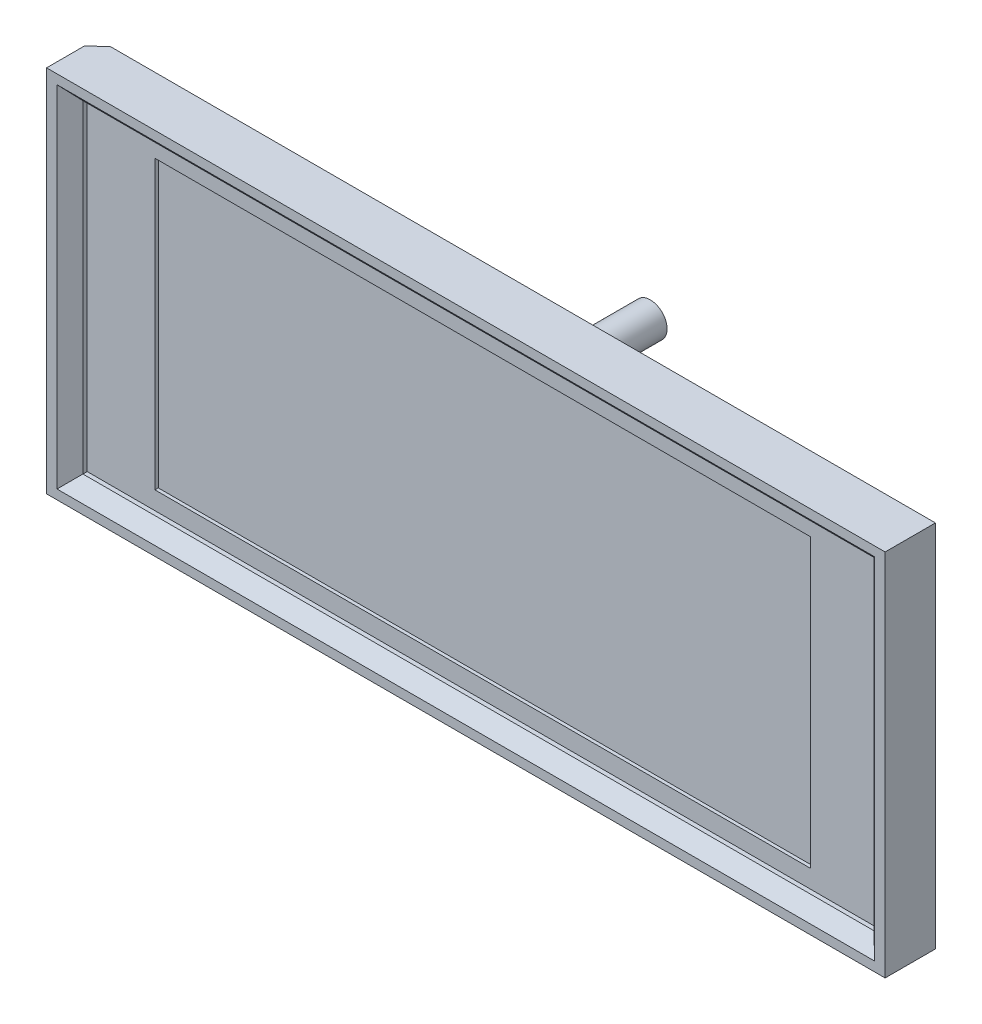
ISO-10303-21;
HEADER;
FILE_DESCRIPTION(('STEP AP214'),'2;1');
FILE_NAME('part.step','',(''),(''),'','','');
FILE_SCHEMA(('AUTOMOTIVE_DESIGN { 1 0 10303 214 1 1 1 1 }'));
ENDSEC;
DATA;
#1=APPLICATION_CONTEXT('core data for automotive mechanical design processes');
#2=APPLICATION_PROTOCOL_DEFINITION('international standard','automotive_design',2000,#1);
#3=PRODUCT_CONTEXT('',#1,'mechanical');
#4=PRODUCT('Part','Part','',(#3));
#5=PRODUCT_RELATED_PRODUCT_CATEGORY('part','',(#4));
#6=PRODUCT_DEFINITION_FORMATION('','',#4);
#7=PRODUCT_DEFINITION_CONTEXT('part definition',#1,'design');
#8=PRODUCT_DEFINITION('design','',#6,#7);
#9=PRODUCT_DEFINITION_SHAPE('','',#8);
#10=(LENGTH_UNIT() NAMED_UNIT(*) SI_UNIT(.MILLI.,.METRE.));
#11=(NAMED_UNIT(*) PLANE_ANGLE_UNIT() SI_UNIT($,.RADIAN.));
#12=(NAMED_UNIT(*) SI_UNIT($,.STERADIAN.) SOLID_ANGLE_UNIT());
#13=UNCERTAINTY_MEASURE_WITH_UNIT(LENGTH_MEASURE(1.E-05),#10,'distance_accuracy_value','');
#14=(GEOMETRIC_REPRESENTATION_CONTEXT(3) GLOBAL_UNCERTAINTY_ASSIGNED_CONTEXT((#13)) GLOBAL_UNIT_ASSIGNED_CONTEXT((#10,
#11,#12)) REPRESENTATION_CONTEXT('',''));
#15=CARTESIAN_POINT('',(0.,0.,0.));
#16=DIRECTION('',(0.,0.,1.));
#17=DIRECTION('',(1.,0.,0.));
#18=AXIS2_PLACEMENT_3D('',#15,#16,#17);
#19=CARTESIAN_POINT('',(0.,0.,10.));
#20=DIRECTION('',(0.,0.,-1.));
#21=DIRECTION('',(-1.,0.,0.));
#22=AXIS2_PLACEMENT_3D('',#19,#20,#21);
#23=PLANE('',#22);
#24=DIRECTION('',(0.,1.,0.));
#25=VECTOR('',#24,1.);
#26=CARTESIAN_POINT('',(117.897170083495,-48.1943324583654,10.));
#27=LINE('',#26,#25);
#28=CARTESIAN_POINT('',(117.897170083495,-48.1943324583654,10.));
#29=VERTEX_POINT('',#28);
#30=CARTESIAN_POINT('',(117.897170083495,48.1943324583654,10.));
#31=VERTEX_POINT('',#30);
#32=EDGE_CURVE('E182',#29,#31,#27,.T.);
#33=ORIENTED_EDGE('',*,*,#32,.T.);
#34=DIRECTION('',(-1.,0.,0.));
#35=VECTOR('',#34,1.);
#36=CARTESIAN_POINT('',(-117.897170083495,48.1943324583654,10.));
#37=LINE('',#36,#35);
#38=CARTESIAN_POINT('',(-117.897170083495,48.1943324583654,10.));
#39=VERTEX_POINT('',#38);
#40=EDGE_CURVE('E189',#31,#39,#37,.T.);
#41=ORIENTED_EDGE('',*,*,#40,.T.);
#42=DIRECTION('',(0.,-1.,0.));
#43=VECTOR('',#42,1.);
#44=CARTESIAN_POINT('',(-117.897170083495,-48.1943324583654,10.));
#45=LINE('',#44,#43);
#46=CARTESIAN_POINT('',(-117.897170083495,-48.1943324583654,10.));
#47=VERTEX_POINT('',#46);
#48=EDGE_CURVE('E192',#39,#47,#45,.T.);
#49=ORIENTED_EDGE('',*,*,#48,.T.);
#50=DIRECTION('',(1.,0.,0.));
#51=VECTOR('',#50,1.);
#52=CARTESIAN_POINT('',(-117.897170083495,-48.1943324583654,10.));
#53=LINE('',#52,#51);
#54=EDGE_CURVE('E195',#47,#29,#53,.T.);
#55=ORIENTED_EDGE('',*,*,#54,.T.);
#56=EDGE_LOOP('',(#33,#41,#49,#55));
#57=FACE_BOUND('',#56,.T.);
#58=DIRECTION('',(0.,1.,0.));
#59=VECTOR('',#58,1.);
#60=CARTESIAN_POINT('',(97.6929291235251,-42.8106903286789,10.));
#61=LINE('',#60,#59);
#62=CARTESIAN_POINT('',(97.6929291235251,-42.8106903286789,10.));
#63=VERTEX_POINT('',#62);
#64=CARTESIAN_POINT('',(97.6929291235251,42.8106903286789,10.));
#65=VERTEX_POINT('',#64);
#66=EDGE_CURVE('E148',#63,#65,#61,.T.);
#67=ORIENTED_EDGE('',*,*,#66,.F.);
#68=DIRECTION('',(1.,0.,0.));
#69=VECTOR('',#68,1.);
#70=CARTESIAN_POINT('',(-97.6929291235251,-42.8106903286789,10.));
#71=LINE('',#70,#69);
#72=CARTESIAN_POINT('',(-97.6929291235251,-42.8106903286789,10.));
#73=VERTEX_POINT('',#72);
#74=EDGE_CURVE('E165',#73,#63,#71,.T.);
#75=ORIENTED_EDGE('',*,*,#74,.F.);
#76=DIRECTION('',(0.,-1.,0.));
#77=VECTOR('',#76,1.);
#78=CARTESIAN_POINT('',(-97.6929291235251,-42.8106903286789,10.));
#79=LINE('',#78,#77);
#80=CARTESIAN_POINT('',(-97.6929291235251,42.8106903286789,10.));
#81=VERTEX_POINT('',#80);
#82=EDGE_CURVE('E168',#81,#73,#79,.T.);
#83=ORIENTED_EDGE('',*,*,#82,.F.);
#84=DIRECTION('',(-1.,0.,0.));
#85=VECTOR('',#84,1.);
#86=CARTESIAN_POINT('',(-97.6929291235251,42.8106903286789,10.));
#87=LINE('',#86,#85);
#88=EDGE_CURVE('E177',#65,#81,#87,.T.);
#89=ORIENTED_EDGE('',*,*,#88,.F.);
#90=EDGE_LOOP('',(#67,#75,#83,#89));
#91=FACE_BOUND('',#90,.T.);
#92=ADVANCED_FACE('F33',(#57,#91),#23,.F.);
#93=CARTESIAN_POINT('',(125.,-55.,15.));
#94=DIRECTION('',(-1.,0.,0.));
#95=DIRECTION('',(0.,0.,1.));
#96=AXIS2_PLACEMENT_3D('',#93,#94,#95);
#97=PLANE('',#96);
#98=DIRECTION('',(0.,1.,0.));
#99=VECTOR('',#98,1.);
#100=CARTESIAN_POINT('',(125.,-55.,0.));
#101=LINE('',#100,#99);
#102=CARTESIAN_POINT('',(125.,-55.,0.));
#103=VERTEX_POINT('',#102);
#104=CARTESIAN_POINT('',(125.,55.,0.));
#105=VERTEX_POINT('',#104);
#106=EDGE_CURVE('E201',#103,#105,#101,.T.);
#107=ORIENTED_EDGE('',*,*,#106,.T.);
#108=DIRECTION('',(0.,0.,-1.));
#109=VECTOR('',#108,1.);
#110=CARTESIAN_POINT('',(125.,55.,15.));
#111=LINE('',#110,#109);
#112=CARTESIAN_POINT('',(125.,55.,15.));
#113=VERTEX_POINT('',#112);
#114=EDGE_CURVE('E233',#113,#105,#111,.T.);
#115=ORIENTED_EDGE('',*,*,#114,.F.);
#116=DIRECTION('',(0.,1.,0.));
#117=VECTOR('',#116,1.);
#118=CARTESIAN_POINT('',(125.,-55.,15.));
#119=LINE('',#118,#117);
#120=CARTESIAN_POINT('',(125.,-55.,15.));
#121=VERTEX_POINT('',#120);
#122=EDGE_CURVE('E208',#121,#113,#119,.T.);
#123=ORIENTED_EDGE('',*,*,#122,.F.);
#124=DIRECTION('',(0.,0.,-1.));
#125=VECTOR('',#124,1.);
#126=CARTESIAN_POINT('',(125.,-55.,15.));
#127=LINE('',#126,#125);
#128=EDGE_CURVE('E218',#121,#103,#127,.T.);
#129=ORIENTED_EDGE('',*,*,#128,.T.);
#130=EDGE_LOOP('',(#107,#115,#123,#129));
#131=FACE_BOUND('',#130,.T.);
#132=ADVANCED_FACE('F309',(#131),#97,.F.);
#133=CARTESIAN_POINT('',(-125.,55.,15.));
#134=DIRECTION('',(0.,-1.,0.));
#135=DIRECTION('',(0.,0.,-1.));
#136=AXIS2_PLACEMENT_3D('',#133,#134,#135);
#137=PLANE('',#136);
#138=DIRECTION('',(-1.,0.,0.));
#139=VECTOR('',#138,1.);
#140=CARTESIAN_POINT('',(-125.,55.,0.));
#141=LINE('',#140,#139);
#142=CARTESIAN_POINT('',(-121.,55.,0.));
#143=VERTEX_POINT('',#142);
#144=EDGE_CURVE('E221',#105,#143,#141,.T.);
#145=ORIENTED_EDGE('',*,*,#144,.T.);
#146=DIRECTION('',(-0.731353701619173,0.,0.681998360062496));
#147=VECTOR('',#146,1.);
#148=CARTESIAN_POINT('',(-125.,55.,3.73006034455065));
#149=LINE('',#148,#147);
#150=CARTESIAN_POINT('',(-125.,55.,3.73006034455065));
#151=VERTEX_POINT('',#150);
#152=EDGE_CURVE('E243',#143,#151,#149,.T.);
#153=ORIENTED_EDGE('',*,*,#152,.T.);
#154=DIRECTION('',(0.,0.,-1.));
#155=VECTOR('',#154,1.);
#156=CARTESIAN_POINT('',(-125.,55.,15.));
#157=LINE('',#156,#155);
#158=CARTESIAN_POINT('',(-125.,55.,15.));
#159=VERTEX_POINT('',#158);
#160=EDGE_CURVE('E230',#159,#151,#157,.T.);
#161=ORIENTED_EDGE('',*,*,#160,.F.);
#162=DIRECTION('',(-1.,0.,0.));
#163=VECTOR('',#162,1.);
#164=CARTESIAN_POINT('',(-125.,55.,15.));
#165=LINE('',#164,#163);
#166=EDGE_CURVE('E211',#113,#159,#165,.T.);
#167=ORIENTED_EDGE('',*,*,#166,.F.);
#168=ORIENTED_EDGE('',*,*,#114,.T.);
#169=EDGE_LOOP('',(#145,#153,#161,#167,#168));
#170=FACE_BOUND('',#169,.T.);
#171=ADVANCED_FACE('F314',(#170),#137,.F.);
#172=CARTESIAN_POINT('',(-125.,-55.,15.));
#173=DIRECTION('',(1.,0.,0.));
#174=DIRECTION('',(0.,0.,-1.));
#175=AXIS2_PLACEMENT_3D('',#172,#173,#174);
#176=PLANE('',#175);
#177=ORIENTED_EDGE('',*,*,#160,.T.);
#178=DIRECTION('',(0.,-1.,0.));
#179=VECTOR('',#178,1.);
#180=CARTESIAN_POINT('',(-125.,-55.,3.73006034455065));
#181=LINE('',#180,#179);
#182=CARTESIAN_POINT('',(-125.,-55.,3.73006034455065));
#183=VERTEX_POINT('',#182);
#184=EDGE_CURVE('E236',#151,#183,#181,.T.);
#185=ORIENTED_EDGE('',*,*,#184,.T.);
#186=DIRECTION('',(0.,0.,-1.));
#187=VECTOR('',#186,1.);
#188=CARTESIAN_POINT('',(-125.,-55.,15.));
#189=LINE('',#188,#187);
#190=CARTESIAN_POINT('',(-125.,-55.,15.));
#191=VERTEX_POINT('',#190);
#192=EDGE_CURVE('E227',#191,#183,#189,.T.);
#193=ORIENTED_EDGE('',*,*,#192,.F.);
#194=DIRECTION('',(0.,-1.,0.));
#195=VECTOR('',#194,1.);
#196=CARTESIAN_POINT('',(-125.,-55.,15.));
#197=LINE('',#196,#195);
#198=EDGE_CURVE('E214',#159,#191,#197,.T.);
#199=ORIENTED_EDGE('',*,*,#198,.F.);
#200=EDGE_LOOP('',(#177,#185,#193,#199));
#201=FACE_BOUND('',#200,.T.);
#202=ADVANCED_FACE('F335',(#201),#176,.F.);
#203=CARTESIAN_POINT('',(-125.,-55.,15.));
#204=DIRECTION('',(0.,1.,0.));
#205=DIRECTION('',(0.,0.,1.));
#206=AXIS2_PLACEMENT_3D('',#203,#204,#205);
#207=PLANE('',#206);
#208=ORIENTED_EDGE('',*,*,#192,.T.);
#209=DIRECTION('',(0.731353701619173,0.,-0.681998360062496));
#210=VECTOR('',#209,1.);
#211=CARTESIAN_POINT('',(-125.,-55.,3.73006034455065));
#212=LINE('',#211,#210);
#213=CARTESIAN_POINT('',(-121.,-55.,0.));
#214=VERTEX_POINT('',#213);
#215=EDGE_CURVE('E239',#183,#214,#212,.T.);
#216=ORIENTED_EDGE('',*,*,#215,.T.);
#217=DIRECTION('',(1.,0.,0.));
#218=VECTOR('',#217,1.);
#219=CARTESIAN_POINT('',(-125.,-55.,0.));
#220=LINE('',#219,#218);
#221=EDGE_CURVE('E212',#214,#103,#220,.T.);
#222=ORIENTED_EDGE('',*,*,#221,.T.);
#223=ORIENTED_EDGE('',*,*,#128,.F.);
#224=DIRECTION('',(1.,0.,0.));
#225=VECTOR('',#224,1.);
#226=CARTESIAN_POINT('',(-125.,-55.,15.));
#227=LINE('',#226,#225);
#228=EDGE_CURVE('E216',#191,#121,#227,.T.);
#229=ORIENTED_EDGE('',*,*,#228,.F.);
#230=EDGE_LOOP('',(#208,#216,#222,#223,#229));
#231=FACE_BOUND('',#230,.T.);
#232=ADVANCED_FACE('F331',(#231),#207,.F.);
#233=CARTESIAN_POINT('',(0.,0.,15.));
#234=DIRECTION('',(0.,0.,-1.));
#235=DIRECTION('',(-1.,0.,0.));
#236=AXIS2_PLACEMENT_3D('',#233,#234,#235);
#237=PLANE('',#236);
#238=DIRECTION('',(0.,-1.,0.));
#239=VECTOR('',#238,1.);
#240=CARTESIAN_POINT('',(121.897170083495,0.,15.));
#241=LINE('',#240,#239);
#242=CARTESIAN_POINT('',(121.897170083495,52.1943324583654,15.));
#243=VERTEX_POINT('',#242);
#244=CARTESIAN_POINT('',(121.897170083495,-52.1943324583654,15.));
#245=VERTEX_POINT('',#244);
#246=EDGE_CURVE('E252',#243,#245,#241,.T.);
#247=ORIENTED_EDGE('',*,*,#246,.T.);
#248=DIRECTION('',(-1.,0.,0.));
#249=VECTOR('',#248,1.);
#250=CARTESIAN_POINT('',(0.,-52.1943324583654,15.));
#251=LINE('',#250,#249);
#252=CARTESIAN_POINT('',(-121.897170083495,-52.1943324583654,15.));
#253=VERTEX_POINT('',#252);
#254=EDGE_CURVE('E254',#245,#253,#251,.T.);
#255=ORIENTED_EDGE('',*,*,#254,.T.);
#256=DIRECTION('',(0.,1.,0.));
#257=VECTOR('',#256,1.);
#258=CARTESIAN_POINT('',(-121.897170083495,0.,15.));
#259=LINE('',#258,#257);
#260=CARTESIAN_POINT('',(-121.897170083495,52.1943324583654,15.));
#261=VERTEX_POINT('',#260);
#262=EDGE_CURVE('E248',#253,#261,#259,.T.);
#263=ORIENTED_EDGE('',*,*,#262,.T.);
#264=DIRECTION('',(1.,0.,0.));
#265=VECTOR('',#264,1.);
#266=CARTESIAN_POINT('',(0.,52.1943324583654,15.));
#267=LINE('',#266,#265);
#268=EDGE_CURVE('E250',#261,#243,#267,.T.);
#269=ORIENTED_EDGE('',*,*,#268,.T.);
#270=EDGE_LOOP('',(#247,#255,#263,#269));
#271=FACE_BOUND('',#270,.T.);
#272=ORIENTED_EDGE('',*,*,#122,.T.);
#273=ORIENTED_EDGE('',*,*,#166,.T.);
#274=ORIENTED_EDGE('',*,*,#198,.T.);
#275=ORIENTED_EDGE('',*,*,#228,.T.);
#276=EDGE_LOOP('',(#272,#273,#274,#275));
#277=FACE_BOUND('',#276,.T.);
#278=ADVANCED_FACE('F278',(#271,#277),#237,.F.);
#279=CARTESIAN_POINT('',(0.,0.,0.));
#280=DIRECTION('',(0.,0.,-1.));
#281=DIRECTION('',(-1.,0.,0.));
#282=AXIS2_PLACEMENT_3D('',#279,#280,#281);
#283=PLANE('',#282);
#284=CARTESIAN_POINT('',(0.,25.093271362693,0.));
#285=DIRECTION('',(0.,0.,-1.));
#286=DIRECTION('',(-1.,0.,0.));
#287=AXIS2_PLACEMENT_3D('',#284,#285,#286);
#288=CIRCLE('',#287,5.);
#289=CARTESIAN_POINT('',(-5.,25.093271362693,0.));
#290=VERTEX_POINT('',#289);
#291=EDGE_CURVE('E171',#290,#290,#288,.T.);
#292=ORIENTED_EDGE('',*,*,#291,.F.);
#293=EDGE_LOOP('',(#292));
#294=FACE_BOUND('',#293,.T.);
#295=ORIENTED_EDGE('',*,*,#221,.F.);
#296=DIRECTION('',(0.,1.,0.));
#297=VECTOR('',#296,1.);
#298=CARTESIAN_POINT('',(-121.,55.,0.));
#299=LINE('',#298,#297);
#300=EDGE_CURVE('E241',#214,#143,#299,.T.);
#301=ORIENTED_EDGE('',*,*,#300,.T.);
#302=ORIENTED_EDGE('',*,*,#144,.F.);
#303=ORIENTED_EDGE('',*,*,#106,.F.);
#304=EDGE_LOOP('',(#295,#301,#302,#303));
#305=FACE_BOUND('',#304,.T.);
#306=ADVANCED_FACE('F323',(#294,#305),#283,.T.);
#307=CARTESIAN_POINT('',(117.897170083495,-48.1943324583654,10.));
#308=DIRECTION('',(1.,0.,0.));
#309=DIRECTION('',(0.,0.,-1.));
#310=AXIS2_PLACEMENT_3D('',#307,#308,#309);
#311=PLANE('',#310);
#312=DIRECTION('',(0.,0.,1.));
#313=VECTOR('',#312,1.);
#314=CARTESIAN_POINT('',(117.897170083495,-48.1943324583654,10.));
#315=LINE('',#314,#313);
#316=CARTESIAN_POINT('',(117.897170083495,-48.1943324583654,11.2699396554494));
#317=VERTEX_POINT('',#316);
#318=EDGE_CURVE('E199',#29,#317,#315,.T.);
#319=ORIENTED_EDGE('',*,*,#318,.T.);
#320=DIRECTION('',(0.,1.,0.));
#321=VECTOR('',#320,1.);
#322=CARTESIAN_POINT('',(117.897170083495,-48.1943324583654,11.2699396554494));
#323=LINE('',#322,#321);
#324=CARTESIAN_POINT('',(117.897170083495,48.1943324583654,11.2699396554494));
#325=VERTEX_POINT('',#324);
#326=EDGE_CURVE('E57',#317,#325,#323,.T.);
#327=ORIENTED_EDGE('',*,*,#326,.T.);
#328=DIRECTION('',(0.,0.,1.));
#329=VECTOR('',#328,1.);
#330=CARTESIAN_POINT('',(117.897170083495,48.1943324583654,10.));
#331=LINE('',#330,#329);
#332=EDGE_CURVE('E198',#31,#325,#331,.T.);
#333=ORIENTED_EDGE('',*,*,#332,.F.);
#334=ORIENTED_EDGE('',*,*,#32,.F.);
#335=EDGE_LOOP('',(#319,#327,#333,#334));
#336=FACE_BOUND('',#335,.T.);
#337=ADVANCED_FACE('F290',(#336),#311,.F.);
#338=CARTESIAN_POINT('',(-117.897170083495,-48.1943324583654,10.));
#339=DIRECTION('',(0.,-1.,0.));
#340=DIRECTION('',(0.,0.,-1.));
#341=AXIS2_PLACEMENT_3D('',#338,#339,#340);
#342=PLANE('',#341);
#343=DIRECTION('',(0.,0.,1.));
#344=VECTOR('',#343,1.);
#345=CARTESIAN_POINT('',(-117.897170083495,-48.1943324583654,10.));
#346=LINE('',#345,#344);
#347=CARTESIAN_POINT('',(-117.897170083495,-48.1943324583654,11.2699396554494));
#348=VERTEX_POINT('',#347);
#349=EDGE_CURVE('E202',#47,#348,#346,.T.);
#350=ORIENTED_EDGE('',*,*,#349,.T.);
#351=DIRECTION('',(1.,0.,0.));
#352=VECTOR('',#351,1.);
#353=CARTESIAN_POINT('',(-117.897170083495,-48.1943324583654,11.2699396554494));
#354=LINE('',#353,#352);
#355=EDGE_CURVE('E245',#348,#317,#354,.T.);
#356=ORIENTED_EDGE('',*,*,#355,.T.);
#357=ORIENTED_EDGE('',*,*,#318,.F.);
#358=ORIENTED_EDGE('',*,*,#54,.F.);
#359=EDGE_LOOP('',(#350,#356,#357,#358));
#360=FACE_BOUND('',#359,.T.);
#361=ADVANCED_FACE('F287',(#360),#342,.F.);
#362=CARTESIAN_POINT('',(-117.897170083495,-48.1943324583654,10.));
#363=DIRECTION('',(-1.,0.,0.));
#364=DIRECTION('',(0.,0.,1.));
#365=AXIS2_PLACEMENT_3D('',#362,#363,#364);
#366=PLANE('',#365);
#367=DIRECTION('',(0.,0.,1.));
#368=VECTOR('',#367,1.);
#369=CARTESIAN_POINT('',(-117.897170083495,48.1943324583654,10.));
#370=LINE('',#369,#368);
#371=CARTESIAN_POINT('',(-117.897170083495,48.1943324583654,11.2699396554494));
#372=VERTEX_POINT('',#371);
#373=EDGE_CURVE('E205',#39,#372,#370,.T.);
#374=ORIENTED_EDGE('',*,*,#373,.T.);
#375=DIRECTION('',(0.,-1.,0.));
#376=VECTOR('',#375,1.);
#377=CARTESIAN_POINT('',(-117.897170083495,-48.1943324583654,11.2699396554494));
#378=LINE('',#377,#376);
#379=EDGE_CURVE('E11',#372,#348,#378,.T.);
#380=ORIENTED_EDGE('',*,*,#379,.T.);
#381=ORIENTED_EDGE('',*,*,#349,.F.);
#382=ORIENTED_EDGE('',*,*,#48,.F.);
#383=EDGE_LOOP('',(#374,#380,#381,#382));
#384=FACE_BOUND('',#383,.T.);
#385=ADVANCED_FACE('F296',(#384),#366,.F.);
#386=CARTESIAN_POINT('',(-117.897170083495,48.1943324583654,10.));
#387=DIRECTION('',(0.,1.,0.));
#388=DIRECTION('',(0.,0.,1.));
#389=AXIS2_PLACEMENT_3D('',#386,#387,#388);
#390=PLANE('',#389);
#391=ORIENTED_EDGE('',*,*,#332,.T.);
#392=DIRECTION('',(-1.,0.,0.));
#393=VECTOR('',#392,1.);
#394=CARTESIAN_POINT('',(-117.897170083495,48.1943324583654,11.2699396554494));
#395=LINE('',#394,#393);
#396=EDGE_CURVE('E42',#325,#372,#395,.T.);
#397=ORIENTED_EDGE('',*,*,#396,.T.);
#398=ORIENTED_EDGE('',*,*,#373,.F.);
#399=ORIENTED_EDGE('',*,*,#40,.F.);
#400=EDGE_LOOP('',(#391,#397,#398,#399));
#401=FACE_BOUND('',#400,.T.);
#402=ADVANCED_FACE('F297',(#401),#390,.F.);
#403=CARTESIAN_POINT('',(97.6929291235251,-42.8106903286789,9.));
#404=DIRECTION('',(1.,0.,0.));
#405=DIRECTION('',(0.,0.,-1.));
#406=AXIS2_PLACEMENT_3D('',#403,#404,#405);
#407=PLANE('',#406);
#408=ORIENTED_EDGE('',*,*,#66,.T.);
#409=DIRECTION('',(0.,0.,1.));
#410=VECTOR('',#409,1.);
#411=CARTESIAN_POINT('',(97.6929291235251,42.8106903286789,9.));
#412=LINE('',#411,#410);
#413=CARTESIAN_POINT('',(97.6929291235251,42.8106903286789,9.));
#414=VERTEX_POINT('',#413);
#415=EDGE_CURVE('E141',#414,#65,#412,.T.);
#416=ORIENTED_EDGE('',*,*,#415,.F.);
#417=DIRECTION('',(0.,1.,0.));
#418=VECTOR('',#417,1.);
#419=CARTESIAN_POINT('',(97.6929291235251,-42.8106903286789,9.));
#420=LINE('',#419,#418);
#421=CARTESIAN_POINT('',(97.6929291235251,-42.8106903286789,9.));
#422=VERTEX_POINT('',#421);
#423=EDGE_CURVE('E145',#422,#414,#420,.T.);
#424=ORIENTED_EDGE('',*,*,#423,.F.);
#425=DIRECTION('',(0.,0.,1.));
#426=VECTOR('',#425,1.);
#427=CARTESIAN_POINT('',(97.6929291235251,-42.8106903286789,9.));
#428=LINE('',#427,#426);
#429=EDGE_CURVE('E180',#422,#63,#428,.T.);
#430=ORIENTED_EDGE('',*,*,#429,.T.);
#431=EDGE_LOOP('',(#408,#416,#424,#430));
#432=FACE_BOUND('',#431,.T.);
#433=ADVANCED_FACE('F143',(#432),#407,.F.);
#434=CARTESIAN_POINT('',(-97.6929291235251,-42.8106903286789,9.));
#435=DIRECTION('',(0.,-1.,0.));
#436=DIRECTION('',(0.,0.,-1.));
#437=AXIS2_PLACEMENT_3D('',#434,#435,#436);
#438=PLANE('',#437);
#439=ORIENTED_EDGE('',*,*,#74,.T.);
#440=ORIENTED_EDGE('',*,*,#429,.F.);
#441=DIRECTION('',(1.,0.,0.));
#442=VECTOR('',#441,1.);
#443=CARTESIAN_POINT('',(-97.6929291235251,-42.8106903286789,9.));
#444=LINE('',#443,#442);
#445=CARTESIAN_POINT('',(-97.6929291235251,-42.8106903286789,9.));
#446=VERTEX_POINT('',#445);
#447=EDGE_CURVE('E153',#446,#422,#444,.T.);
#448=ORIENTED_EDGE('',*,*,#447,.F.);
#449=DIRECTION('',(0.,0.,1.));
#450=VECTOR('',#449,1.);
#451=CARTESIAN_POINT('',(-97.6929291235251,-42.8106903286789,9.));
#452=LINE('',#451,#450);
#453=EDGE_CURVE('E183',#446,#73,#452,.T.);
#454=ORIENTED_EDGE('',*,*,#453,.T.);
#455=EDGE_LOOP('',(#439,#440,#448,#454));
#456=FACE_BOUND('',#455,.T.);
#457=ADVANCED_FACE('F304',(#456),#438,.F.);
#458=CARTESIAN_POINT('',(-97.6929291235251,-42.8106903286789,9.));
#459=DIRECTION('',(-1.,0.,0.));
#460=DIRECTION('',(0.,0.,1.));
#461=AXIS2_PLACEMENT_3D('',#458,#459,#460);
#462=PLANE('',#461);
#463=ORIENTED_EDGE('',*,*,#82,.T.);
#464=ORIENTED_EDGE('',*,*,#453,.F.);
#465=DIRECTION('',(0.,-1.,0.));
#466=VECTOR('',#465,1.);
#467=CARTESIAN_POINT('',(-97.6929291235251,-42.8106903286789,9.));
#468=LINE('',#467,#466);
#469=CARTESIAN_POINT('',(-97.6929291235251,42.8106903286789,9.));
#470=VERTEX_POINT('',#469);
#471=EDGE_CURVE('E161',#470,#446,#468,.T.);
#472=ORIENTED_EDGE('',*,*,#471,.F.);
#473=DIRECTION('',(0.,0.,1.));
#474=VECTOR('',#473,1.);
#475=CARTESIAN_POINT('',(-97.6929291235251,42.8106903286789,9.));
#476=LINE('',#475,#474);
#477=EDGE_CURVE('E152',#470,#81,#476,.T.);
#478=ORIENTED_EDGE('',*,*,#477,.T.);
#479=EDGE_LOOP('',(#463,#464,#472,#478));
#480=FACE_BOUND('',#479,.T.);
#481=ADVANCED_FACE('F374',(#480),#462,.F.);
#482=CARTESIAN_POINT('',(-97.6929291235251,42.8106903286789,9.));
#483=DIRECTION('',(0.,1.,0.));
#484=DIRECTION('',(0.,0.,1.));
#485=AXIS2_PLACEMENT_3D('',#482,#483,#484);
#486=PLANE('',#485);
#487=ORIENTED_EDGE('',*,*,#88,.T.);
#488=ORIENTED_EDGE('',*,*,#477,.F.);
#489=DIRECTION('',(-1.,0.,0.));
#490=VECTOR('',#489,1.);
#491=CARTESIAN_POINT('',(-97.6929291235251,42.8106903286789,9.));
#492=LINE('',#491,#490);
#493=EDGE_CURVE('E156',#414,#470,#492,.T.);
#494=ORIENTED_EDGE('',*,*,#493,.F.);
#495=ORIENTED_EDGE('',*,*,#415,.T.);
#496=EDGE_LOOP('',(#487,#488,#494,#495));
#497=FACE_BOUND('',#496,.T.);
#498=ADVANCED_FACE('F157',(#497),#486,.F.);
#499=CARTESIAN_POINT('',(0.,0.,9.));
#500=DIRECTION('',(0.,0.,-1.));
#501=DIRECTION('',(-1.,0.,0.));
#502=AXIS2_PLACEMENT_3D('',#499,#500,#501);
#503=PLANE('',#502);
#504=ORIENTED_EDGE('',*,*,#423,.T.);
#505=ORIENTED_EDGE('',*,*,#493,.T.);
#506=ORIENTED_EDGE('',*,*,#471,.T.);
#507=ORIENTED_EDGE('',*,*,#447,.T.);
#508=EDGE_LOOP('',(#504,#505,#506,#507));
#509=FACE_BOUND('',#508,.T.);
#510=ADVANCED_FACE('F163',(#509),#503,.F.);
#511=CARTESIAN_POINT('',(-125.,-55.,3.73006034455065));
#512=DIRECTION('',(-0.681998360062496,0.,-0.731353701619173));
#513=DIRECTION('',(0.,1.,0.));
#514=AXIS2_PLACEMENT_3D('',#511,#512,#513);
#515=PLANE('',#514);
#516=ORIENTED_EDGE('',*,*,#152,.F.);
#517=ORIENTED_EDGE('',*,*,#300,.F.);
#518=ORIENTED_EDGE('',*,*,#215,.F.);
#519=ORIENTED_EDGE('',*,*,#184,.F.);
#520=EDGE_LOOP('',(#516,#517,#518,#519));
#521=FACE_BOUND('',#520,.T.);
#522=ADVANCED_FACE('F343',(#521),#515,.T.);
#523=CARTESIAN_POINT('',(-117.897170083495,48.1943324583654,11.2699396554494));
#524=DIRECTION('',(0.,0.681998360062496,-0.731353701619173));
#525=DIRECTION('',(-1.,0.,0.));
#526=AXIS2_PLACEMENT_3D('',#523,#524,#525);
#527=PLANE('',#526);
#528=DIRECTION('',(0.590324081032981,0.590324081032981,0.550486111273602));
#529=VECTOR('',#528,1.);
#530=CARTESIAN_POINT('',(84.3074051714718,14.6045675463422,-20.0530228648295));
#531=LINE('',#530,#529);
#532=EDGE_CURVE('E263',#243,#325,#531,.F.);
#533=ORIENTED_EDGE('',*,*,#532,.F.);
#534=ORIENTED_EDGE('',*,*,#268,.F.);
#535=DIRECTION('',(-0.590324081032981,0.590324081032981,0.550486111273602));
#536=VECTOR('',#535,1.);
#537=CARTESIAN_POINT('',(-117.897170083495,48.1943324583654,11.2699396554494));
#538=LINE('',#537,#536);
#539=EDGE_CURVE('E37',#372,#261,#538,.T.);
#540=ORIENTED_EDGE('',*,*,#539,.F.);
#541=ORIENTED_EDGE('',*,*,#396,.F.);
#542=EDGE_LOOP('',(#533,#534,#540,#541));
#543=FACE_BOUND('',#542,.T.);
#544=ADVANCED_FACE('F35',(#543),#527,.F.);
#545=CARTESIAN_POINT('',(-117.897170083495,-48.1943324583654,11.2699396554494));
#546=DIRECTION('',(-0.681998360062496,0.,-0.731353701619173));
#547=DIRECTION('',(0.,-1.,0.));
#548=AXIS2_PLACEMENT_3D('',#545,#546,#547);
#549=PLANE('',#548);
#550=ORIENTED_EDGE('',*,*,#539,.T.);
#551=ORIENTED_EDGE('',*,*,#262,.F.);
#552=DIRECTION('',(0.590324081032981,0.590324081032981,-0.550486111273602));
#553=VECTOR('',#552,1.);
#554=CARTESIAN_POINT('',(-117.897170083495,-48.1943324583654,11.2699396554494));
#555=LINE('',#554,#553);
#556=EDGE_CURVE('E261',#348,#253,#555,.F.);
#557=ORIENTED_EDGE('',*,*,#556,.F.);
#558=ORIENTED_EDGE('',*,*,#379,.F.);
#559=EDGE_LOOP('',(#550,#551,#557,#558));
#560=FACE_BOUND('',#559,.T.);
#561=ADVANCED_FACE('F273',(#560),#549,.F.);
#562=CARTESIAN_POINT('',(117.897170083495,-48.1943324583654,11.2699396554494));
#563=DIRECTION('',(0.681998360062496,0.,-0.731353701619173));
#564=DIRECTION('',(0.,1.,0.));
#565=AXIS2_PLACEMENT_3D('',#562,#563,#564);
#566=PLANE('',#565);
#567=ORIENTED_EDGE('',*,*,#532,.T.);
#568=ORIENTED_EDGE('',*,*,#326,.F.);
#569=DIRECTION('',(0.590324081032981,-0.590324081032981,0.550486111273602));
#570=VECTOR('',#569,1.);
#571=CARTESIAN_POINT('',(35.7269640677039,33.9758735574257,-65.3550170853149));
#572=LINE('',#571,#570);
#573=EDGE_CURVE('E259',#245,#317,#572,.F.);
#574=ORIENTED_EDGE('',*,*,#573,.F.);
#575=ORIENTED_EDGE('',*,*,#246,.F.);
#576=EDGE_LOOP('',(#567,#568,#574,#575));
#577=FACE_BOUND('',#576,.T.);
#578=ADVANCED_FACE('F285',(#577),#566,.F.);
#579=CARTESIAN_POINT('',(-117.897170083495,-48.1943324583654,11.2699396554494));
#580=DIRECTION('',(0.,-0.681998360062496,-0.731353701619173));
#581=DIRECTION('',(1.,0.,0.));
#582=AXIS2_PLACEMENT_3D('',#579,#580,#581);
#583=PLANE('',#582);
#584=ORIENTED_EDGE('',*,*,#556,.T.);
#585=ORIENTED_EDGE('',*,*,#254,.F.);
#586=ORIENTED_EDGE('',*,*,#573,.T.);
#587=ORIENTED_EDGE('',*,*,#355,.F.);
#588=EDGE_LOOP('',(#584,#585,#586,#587));
#589=FACE_BOUND('',#588,.T.);
#590=ADVANCED_FACE('F283',(#589),#583,.F.);
#591=CARTESIAN_POINT('',(0.,25.093271362693,-40.));
#592=DIRECTION('',(0.,0.,1.));
#593=DIRECTION('',(1.,0.,0.));
#594=AXIS2_PLACEMENT_3D('',#591,#592,#593);
#595=CYLINDRICAL_SURFACE('',#594,5.);
#596=CARTESIAN_POINT('',(0.,25.093271362693,-40.));
#597=DIRECTION('',(0.,0.,-1.));
#598=DIRECTION('',(-1.,0.,0.));
#599=AXIS2_PLACEMENT_3D('',#596,#597,#598);
#600=CIRCLE('',#599,5.);
#601=CARTESIAN_POINT('',(-5.,25.093271362693,-40.));
#602=VERTEX_POINT('',#601);
#603=EDGE_CURVE('E262',#602,#602,#600,.T.);
#604=ORIENTED_EDGE('',*,*,#603,.F.);
#605=EDGE_LOOP('',(#604));
#606=FACE_BOUND('',#605,.T.);
#607=ORIENTED_EDGE('',*,*,#291,.T.);
#608=EDGE_LOOP('',(#607));
#609=FACE_BOUND('',#608,.T.);
#610=ADVANCED_FACE('F349',(#606,#609),#595,.T.);
#611=CARTESIAN_POINT('',(0.,25.093271362693,-40.));
#612=DIRECTION('',(0.,0.,-1.));
#613=DIRECTION('',(-1.,0.,0.));
#614=AXIS2_PLACEMENT_3D('',#611,#612,#613);
#615=PLANE('',#614);
#616=ORIENTED_EDGE('',*,*,#603,.T.);
#617=EDGE_LOOP('',(#616));
#618=FACE_BOUND('',#617,.T.);
#619=ADVANCED_FACE('F438',(#618),#615,.T.);
#620=CLOSED_SHELL('',(#92,#132,#171,#202,#232,#278,#306,#337,#361,#385,#402,#433,#457,#481,#498,
#510,#522,#544,#561,#578,#590,#610,#619));
#621=MANIFOLD_SOLID_BREP('B2',#620);
#622=ADVANCED_BREP_SHAPE_REPRESENTATION('',(#18,#621),#14);
#623=SHAPE_DEFINITION_REPRESENTATION(#9,#622);
ENDSEC;
END-ISO-10303-21;
